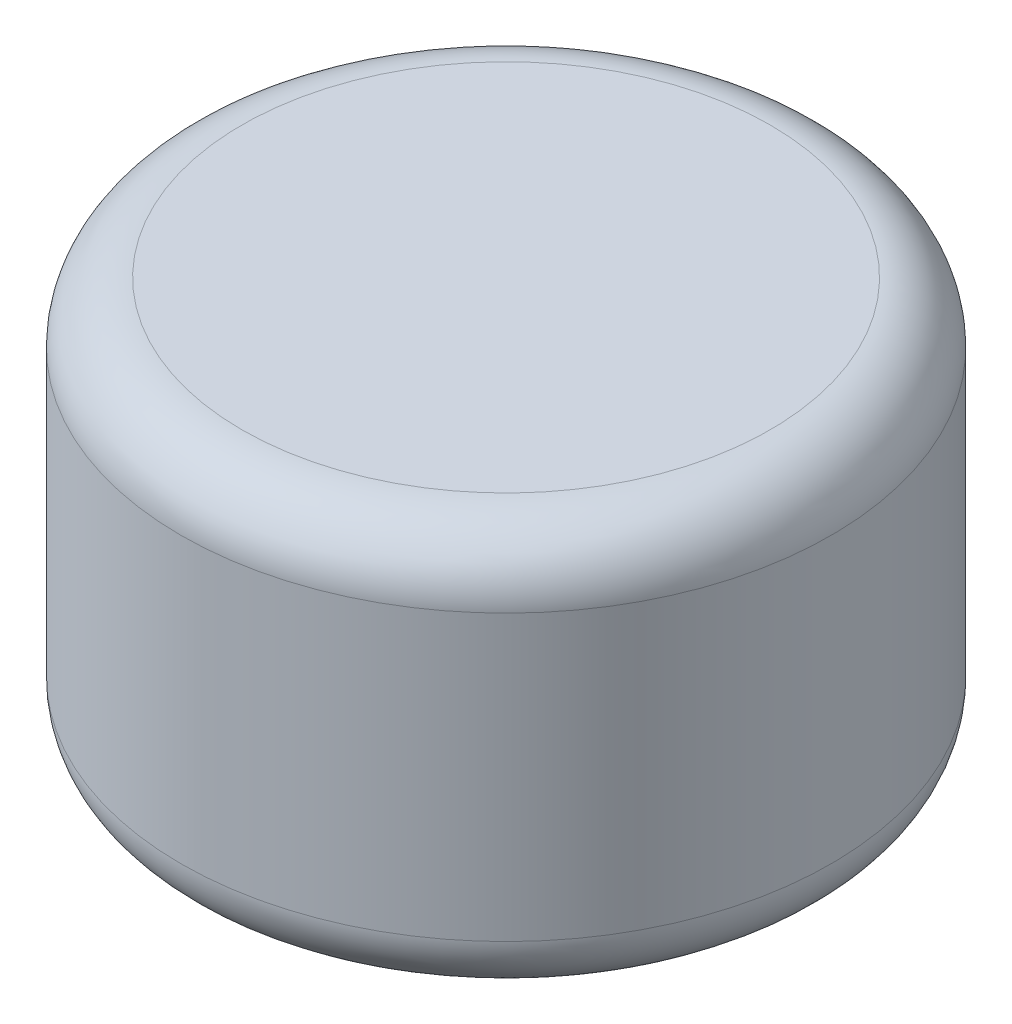
ISO-10303-21;
HEADER;
FILE_DESCRIPTION(('STEP AP214'),'2;1');
FILE_NAME('part.step','',(''),(''),'','','');
FILE_SCHEMA(('AUTOMOTIVE_DESIGN { 1 0 10303 214 1 1 1 1 }'));
ENDSEC;
DATA;
#1=APPLICATION_CONTEXT('core data for automotive mechanical design processes');
#2=APPLICATION_PROTOCOL_DEFINITION('international standard','automotive_design',2000,#1);
#3=PRODUCT_CONTEXT('',#1,'mechanical');
#4=PRODUCT('Part','Part','',(#3));
#5=PRODUCT_RELATED_PRODUCT_CATEGORY('part','',(#4));
#6=PRODUCT_DEFINITION_FORMATION('','',#4);
#7=PRODUCT_DEFINITION_CONTEXT('part definition',#1,'design');
#8=PRODUCT_DEFINITION('design','',#6,#7);
#9=PRODUCT_DEFINITION_SHAPE('','',#8);
#10=(LENGTH_UNIT() NAMED_UNIT(*) SI_UNIT(.MILLI.,.METRE.));
#11=(NAMED_UNIT(*) PLANE_ANGLE_UNIT() SI_UNIT($,.RADIAN.));
#12=(NAMED_UNIT(*) SI_UNIT($,.STERADIAN.) SOLID_ANGLE_UNIT());
#13=UNCERTAINTY_MEASURE_WITH_UNIT(LENGTH_MEASURE(1.E-05),#10,'distance_accuracy_value','');
#14=(GEOMETRIC_REPRESENTATION_CONTEXT(3) GLOBAL_UNCERTAINTY_ASSIGNED_CONTEXT((#13)) GLOBAL_UNIT_ASSIGNED_CONTEXT((#10,
#11,#12)) REPRESENTATION_CONTEXT('',''));
#15=CARTESIAN_POINT('',(0.,0.,0.));
#16=DIRECTION('',(0.,0.,1.));
#17=DIRECTION('',(1.,0.,0.));
#18=AXIS2_PLACEMENT_3D('',#15,#16,#17);
#19=CARTESIAN_POINT('',(0.,20.,0.));
#20=DIRECTION('',(0.,-1.,0.));
#21=DIRECTION('',(0.,0.,-1.));
#22=AXIS2_PLACEMENT_3D('',#19,#20,#21);
#23=CYLINDRICAL_SURFACE('',#22,16.);
#24=CARTESIAN_POINT('',(0.,3.,0.));
#25=DIRECTION('',(0.,1.,0.));
#26=DIRECTION('',(0.,0.,1.));
#27=AXIS2_PLACEMENT_3D('',#24,#25,#26);
#28=CIRCLE('',#27,16.);
#29=CARTESIAN_POINT('',(0.,3.,16.));
#30=VERTEX_POINT('',#29);
#31=EDGE_CURVE('E46',#30,#30,#28,.T.);
#32=ORIENTED_EDGE('',*,*,#31,.T.);
#33=EDGE_LOOP('',(#32));
#34=FACE_BOUND('',#33,.T.);
#35=CARTESIAN_POINT('',(0.,17.,0.));
#36=DIRECTION('',(0.,1.,0.));
#37=DIRECTION('',(0.,0.,1.));
#38=AXIS2_PLACEMENT_3D('',#35,#36,#37);
#39=CIRCLE('',#38,16.);
#40=CARTESIAN_POINT('',(0.,17.,16.));
#41=VERTEX_POINT('',#40);
#42=EDGE_CURVE('E50',#41,#41,#39,.F.);
#43=ORIENTED_EDGE('',*,*,#42,.T.);
#44=EDGE_LOOP('',(#43));
#45=FACE_BOUND('',#44,.T.);
#46=ADVANCED_FACE('F34',(#34,#45),#23,.T.);
#47=CARTESIAN_POINT('',(0.,20.,0.));
#48=DIRECTION('',(0.,1.,0.));
#49=DIRECTION('',(0.,0.,1.));
#50=AXIS2_PLACEMENT_3D('',#47,#48,#49);
#51=PLANE('',#50);
#52=CARTESIAN_POINT('',(0.,20.,0.));
#53=DIRECTION('',(0.,1.,0.));
#54=DIRECTION('',(0.,0.,1.));
#55=AXIS2_PLACEMENT_3D('',#52,#53,#54);
#56=CIRCLE('',#55,13.);
#57=CARTESIAN_POINT('',(0.,20.,13.));
#58=VERTEX_POINT('',#57);
#59=EDGE_CURVE('E11',#58,#58,#56,.T.);
#60=ORIENTED_EDGE('',*,*,#59,.T.);
#61=EDGE_LOOP('',(#60));
#62=FACE_BOUND('',#61,.T.);
#63=ADVANCED_FACE('F97',(#62),#51,.T.);
#64=CARTESIAN_POINT('',(0.,0.,0.));
#65=DIRECTION('',(0.,1.,0.));
#66=DIRECTION('',(0.,0.,1.));
#67=AXIS2_PLACEMENT_3D('',#64,#65,#66);
#68=PLANE('',#67);
#69=CARTESIAN_POINT('',(0.,0.,0.));
#70=DIRECTION('',(0.,1.,0.));
#71=DIRECTION('',(0.,0.,1.));
#72=AXIS2_PLACEMENT_3D('',#69,#70,#71);
#73=CIRCLE('',#72,13.);
#74=CARTESIAN_POINT('',(0.,0.,13.));
#75=VERTEX_POINT('',#74);
#76=EDGE_CURVE('E42',#75,#75,#73,.F.);
#77=ORIENTED_EDGE('',*,*,#76,.T.);
#78=EDGE_LOOP('',(#77));
#79=FACE_BOUND('',#78,.T.);
#80=ADVANCED_FACE('F100',(#79),#68,.F.);
#81=CARTESIAN_POINT('',(0.,3.,0.));
#82=DIRECTION('',(0.,1.,0.));
#83=DIRECTION('',(0.,0.,1.));
#84=AXIS2_PLACEMENT_3D('',#81,#82,#83);
#85=TOROIDAL_SURFACE('',#84,13.,3.);
#86=ORIENTED_EDGE('',*,*,#76,.F.);
#87=EDGE_LOOP('',(#86));
#88=FACE_BOUND('',#87,.T.);
#89=ORIENTED_EDGE('',*,*,#31,.F.);
#90=EDGE_LOOP('',(#89));
#91=FACE_BOUND('',#90,.T.);
#92=ADVANCED_FACE('F102',(#88,#91),#85,.T.);
#93=CARTESIAN_POINT('',(0.,17.,0.));
#94=DIRECTION('',(0.,1.,0.));
#95=DIRECTION('',(0.,0.,1.));
#96=AXIS2_PLACEMENT_3D('',#93,#94,#95);
#97=TOROIDAL_SURFACE('',#96,13.,3.);
#98=ORIENTED_EDGE('',*,*,#42,.F.);
#99=EDGE_LOOP('',(#98));
#100=FACE_BOUND('',#99,.T.);
#101=ORIENTED_EDGE('',*,*,#59,.F.);
#102=EDGE_LOOP('',(#101));
#103=FACE_BOUND('',#102,.T.);
#104=ADVANCED_FACE('F36',(#100,#103),#97,.T.);
#105=CLOSED_SHELL('',(#46,#63,#80,#92,#104));
#106=CARTESIAN_POINT('',(0.,18.,0.));
#107=DIRECTION('',(0.,1.,0.));
#108=DIRECTION('',(0.,0.,1.));
#109=AXIS2_PLACEMENT_3D('',#106,#107,#108);
#110=PLANE('',#109);
#111=CARTESIAN_POINT('',(0.,18.,0.));
#112=DIRECTION('',(0.,1.,0.));
#113=DIRECTION('',(0.,0.,1.));
#114=AXIS2_PLACEMENT_3D('',#111,#112,#113);
#115=CIRCLE('',#114,9.5);
#116=CARTESIAN_POINT('',(0.,18.,9.5));
#117=VERTEX_POINT('',#116);
#118=EDGE_CURVE('E64',#117,#117,#115,.F.);
#119=ORIENTED_EDGE('',*,*,#118,.T.);
#120=EDGE_LOOP('',(#119));
#121=FACE_BOUND('',#120,.T.);
#122=ADVANCED_FACE('F68',(#121),#110,.F.);
#123=CARTESIAN_POINT('',(0.,2.,0.));
#124=DIRECTION('',(0.,1.,0.));
#125=DIRECTION('',(0.,0.,1.));
#126=AXIS2_PLACEMENT_3D('',#123,#124,#125);
#127=PLANE('',#126);
#128=CARTESIAN_POINT('',(0.,2.,0.));
#129=DIRECTION('',(0.,1.,0.));
#130=DIRECTION('',(0.,0.,1.));
#131=AXIS2_PLACEMENT_3D('',#128,#129,#130);
#132=CIRCLE('',#131,9.5);
#133=CARTESIAN_POINT('',(0.,2.,9.5));
#134=VERTEX_POINT('',#133);
#135=EDGE_CURVE('E55',#134,#134,#132,.T.);
#136=ORIENTED_EDGE('',*,*,#135,.T.);
#137=EDGE_LOOP('',(#136));
#138=FACE_BOUND('',#137,.T.);
#139=ADVANCED_FACE('F83',(#138),#127,.T.);
#140=CARTESIAN_POINT('',(0.,-41.0121933088197,0.));
#141=DIRECTION('',(0.,1.,0.));
#142=DIRECTION('',(0.,0.,1.));
#143=AXIS2_PLACEMENT_3D('',#140,#141,#142);
#144=CYLINDRICAL_SURFACE('',#143,14.5);
#145=CARTESIAN_POINT('',(0.,13.,0.));
#146=DIRECTION('',(0.,1.,0.));
#147=DIRECTION('',(0.,0.,1.));
#148=AXIS2_PLACEMENT_3D('',#145,#146,#147);
#149=CIRCLE('',#148,14.5);
#150=CARTESIAN_POINT('',(0.,13.,14.5));
#151=VERTEX_POINT('',#150);
#152=EDGE_CURVE('E58',#151,#151,#149,.T.);
#153=ORIENTED_EDGE('',*,*,#152,.T.);
#154=EDGE_LOOP('',(#153));
#155=FACE_BOUND('',#154,.T.);
#156=CARTESIAN_POINT('',(0.,7.,0.));
#157=DIRECTION('',(0.,1.,0.));
#158=DIRECTION('',(0.,0.,1.));
#159=AXIS2_PLACEMENT_3D('',#156,#157,#158);
#160=CIRCLE('',#159,14.5);
#161=CARTESIAN_POINT('',(0.,7.,14.5));
#162=VERTEX_POINT('',#161);
#163=EDGE_CURVE('E61',#162,#162,#160,.F.);
#164=ORIENTED_EDGE('',*,*,#163,.T.);
#165=EDGE_LOOP('',(#164));
#166=FACE_BOUND('',#165,.T.);
#167=ADVANCED_FACE('F73',(#155,#166),#144,.F.);
#168=CARTESIAN_POINT('',(0.,13.,0.));
#169=DIRECTION('',(0.,1.,0.));
#170=DIRECTION('',(0.,0.,1.));
#171=AXIS2_PLACEMENT_3D('',#168,#169,#170);
#172=TOROIDAL_SURFACE('',#171,9.5,5.);
#173=ORIENTED_EDGE('',*,*,#152,.F.);
#174=EDGE_LOOP('',(#173));
#175=FACE_BOUND('',#174,.T.);
#176=ORIENTED_EDGE('',*,*,#118,.F.);
#177=EDGE_LOOP('',(#176));
#178=FACE_BOUND('',#177,.T.);
#179=ADVANCED_FACE('F70',(#175,#178),#172,.F.);
#180=CARTESIAN_POINT('',(0.,7.,0.));
#181=DIRECTION('',(0.,1.,0.));
#182=DIRECTION('',(0.,0.,1.));
#183=AXIS2_PLACEMENT_3D('',#180,#181,#182);
#184=TOROIDAL_SURFACE('',#183,9.5,5.);
#185=ORIENTED_EDGE('',*,*,#135,.F.);
#186=EDGE_LOOP('',(#185));
#187=FACE_BOUND('',#186,.T.);
#188=ORIENTED_EDGE('',*,*,#163,.F.);
#189=EDGE_LOOP('',(#188));
#190=FACE_BOUND('',#189,.T.);
#191=ADVANCED_FACE('F72',(#187,#190),#184,.F.);
#192=CLOSED_SHELL('',(#122,#139,#167,#179,#191));
#193=ORIENTED_CLOSED_SHELL('',*,#192,.T.);
#194=BREP_WITH_VOIDS('B2',#105,(#193));
#195=ADVANCED_BREP_SHAPE_REPRESENTATION('',(#18,#194),#14);
#196=SHAPE_DEFINITION_REPRESENTATION(#9,#195);
ENDSEC;
END-ISO-10303-21;
